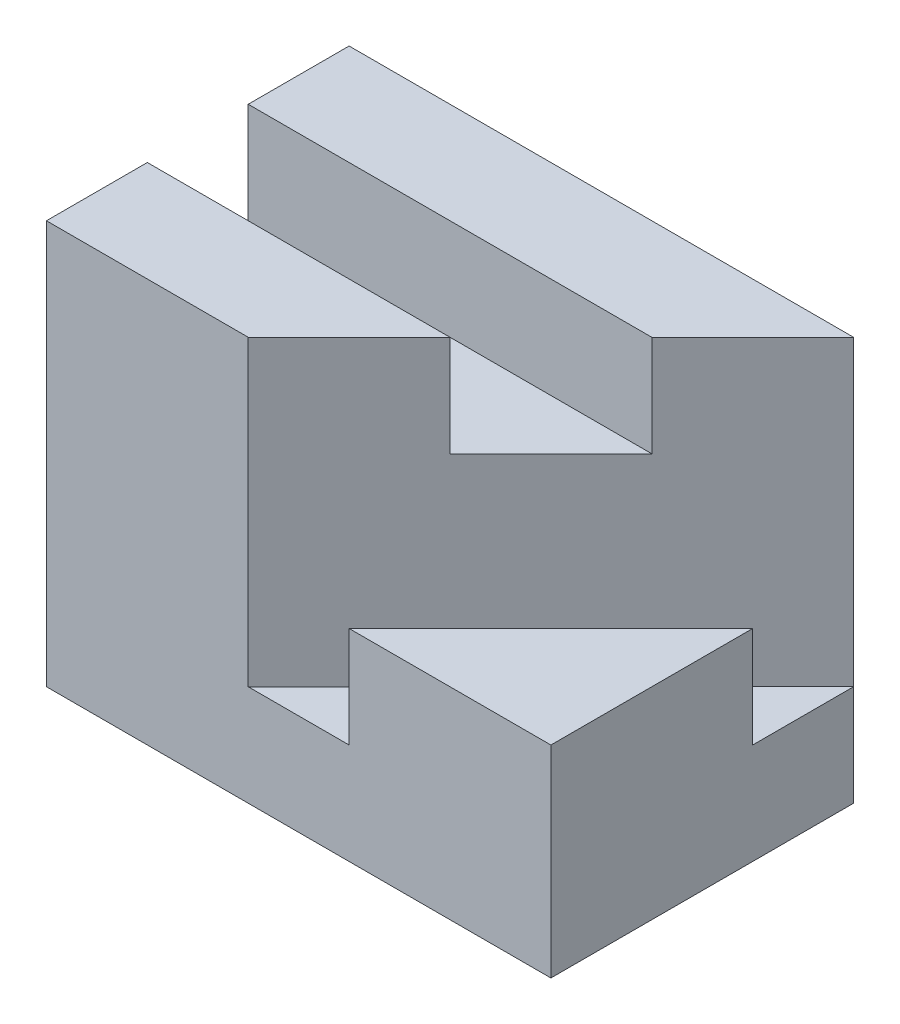
ISO-10303-21;
HEADER;
FILE_DESCRIPTION(('STEP AP214'),'2;1');
FILE_NAME('part.step','',(''),(''),'','','');
FILE_SCHEMA(('AUTOMOTIVE_DESIGN { 1 0 10303 214 1 1 1 1 }'));
ENDSEC;
DATA;
#1=APPLICATION_CONTEXT('core data for automotive mechanical design processes');
#2=APPLICATION_PROTOCOL_DEFINITION('international standard','automotive_design',2000,#1);
#3=PRODUCT_CONTEXT('',#1,'mechanical');
#4=PRODUCT('Part','Part','',(#3));
#5=PRODUCT_RELATED_PRODUCT_CATEGORY('part','',(#4));
#6=PRODUCT_DEFINITION_FORMATION('','',#4);
#7=PRODUCT_DEFINITION_CONTEXT('part definition',#1,'design');
#8=PRODUCT_DEFINITION('design','',#6,#7);
#9=PRODUCT_DEFINITION_SHAPE('','',#8);
#10=(LENGTH_UNIT() NAMED_UNIT(*) SI_UNIT(.MILLI.,.METRE.));
#11=(NAMED_UNIT(*) PLANE_ANGLE_UNIT() SI_UNIT($,.RADIAN.));
#12=(NAMED_UNIT(*) SI_UNIT($,.STERADIAN.) SOLID_ANGLE_UNIT());
#13=UNCERTAINTY_MEASURE_WITH_UNIT(LENGTH_MEASURE(1.E-05),#10,'distance_accuracy_value','');
#14=(GEOMETRIC_REPRESENTATION_CONTEXT(3) GLOBAL_UNCERTAINTY_ASSIGNED_CONTEXT((#13)) GLOBAL_UNIT_ASSIGNED_CONTEXT((#10,
#11,#12)) REPRESENTATION_CONTEXT('',''));
#15=CARTESIAN_POINT('',(0.,0.,0.));
#16=DIRECTION('',(0.,0.,1.));
#17=DIRECTION('',(1.,0.,0.));
#18=AXIS2_PLACEMENT_3D('',#15,#16,#17);
#19=CARTESIAN_POINT('',(-25.,10.,7.50000000000001));
#20=DIRECTION('',(0.,0.,1.));
#21=DIRECTION('',(0.,-1.,0.));
#22=AXIS2_PLACEMENT_3D('',#19,#20,#21);
#23=PLANE('',#22);
#24=DIRECTION('',(0.,-1.,0.));
#25=VECTOR('',#24,1.);
#26=CARTESIAN_POINT('',(0.,10.,7.50000000000001));
#27=LINE('',#26,#25);
#28=CARTESIAN_POINT('',(0.,0.,7.50000000000001));
#29=VERTEX_POINT('',#28);
#30=CARTESIAN_POINT('',(0.,-10.,7.5));
#31=VERTEX_POINT('',#30);
#32=EDGE_CURVE('E129',#29,#31,#27,.T.);
#33=ORIENTED_EDGE('',*,*,#32,.F.);
#34=DIRECTION('',(1.,0.,0.));
#35=VECTOR('',#34,1.);
#36=CARTESIAN_POINT('',(0.,0.,7.50000000000001));
#37=LINE('',#36,#35);
#38=CARTESIAN_POINT('',(-10.,0.,7.50000000000001));
#39=VERTEX_POINT('',#38);
#40=EDGE_CURVE('E120',#39,#29,#37,.T.);
#41=ORIENTED_EDGE('',*,*,#40,.F.);
#42=DIRECTION('',(0.,1.,0.));
#43=VECTOR('',#42,1.);
#44=CARTESIAN_POINT('',(-10.,-5.,7.50000000000001));
#45=LINE('',#44,#43);
#46=CARTESIAN_POINT('',(-10.,-5.,7.50000000000001));
#47=VERTEX_POINT('',#46);
#48=EDGE_CURVE('E127',#47,#39,#45,.T.);
#49=ORIENTED_EDGE('',*,*,#48,.F.);
#50=DIRECTION('',(1.,0.,0.));
#51=VECTOR('',#50,1.);
#52=CARTESIAN_POINT('',(-15.,-5.,7.50000000000001));
#53=LINE('',#52,#51);
#54=CARTESIAN_POINT('',(-15.,-5.,7.50000000000001));
#55=VERTEX_POINT('',#54);
#56=EDGE_CURVE('E233',#55,#47,#53,.T.);
#57=ORIENTED_EDGE('',*,*,#56,.F.);
#58=DIRECTION('',(0.,1.,0.));
#59=VECTOR('',#58,1.);
#60=CARTESIAN_POINT('',(-15.,-5.,7.50000000000001));
#61=LINE('',#60,#59);
#62=CARTESIAN_POINT('',(-15.,10.,7.50000000000001));
#63=VERTEX_POINT('',#62);
#64=EDGE_CURVE('E135',#55,#63,#61,.T.);
#65=ORIENTED_EDGE('',*,*,#64,.T.);
#66=DIRECTION('',(1.,0.,0.));
#67=VECTOR('',#66,1.);
#68=CARTESIAN_POINT('',(-25.,10.,7.50000000000001));
#69=LINE('',#68,#67);
#70=CARTESIAN_POINT('',(-25.,10.,7.50000000000001));
#71=VERTEX_POINT('',#70);
#72=EDGE_CURVE('E184',#71,#63,#69,.T.);
#73=ORIENTED_EDGE('',*,*,#72,.F.);
#74=DIRECTION('',(0.,-1.,0.));
#75=VECTOR('',#74,1.);
#76=CARTESIAN_POINT('',(-25.,10.,7.50000000000001));
#77=LINE('',#76,#75);
#78=CARTESIAN_POINT('',(-25.,-10.,7.5));
#79=VERTEX_POINT('',#78);
#80=EDGE_CURVE('E172',#71,#79,#77,.T.);
#81=ORIENTED_EDGE('',*,*,#80,.T.);
#82=DIRECTION('',(1.,0.,0.));
#83=VECTOR('',#82,1.);
#84=CARTESIAN_POINT('',(-25.,-10.,7.5));
#85=LINE('',#84,#83);
#86=EDGE_CURVE('E42',#79,#31,#85,.T.);
#87=ORIENTED_EDGE('',*,*,#86,.T.);
#88=EDGE_LOOP('',(#33,#41,#49,#57,#65,#73,#81,#87));
#89=FACE_BOUND('',#88,.T.);
#90=ADVANCED_FACE('F33',(#89),#23,.T.);
#91=CARTESIAN_POINT('',(0.,0.,0.));
#92=DIRECTION('',(1.,0.,0.));
#93=DIRECTION('',(0.,0.,-1.));
#94=AXIS2_PLACEMENT_3D('',#91,#92,#93);
#95=PLANE('',#94);
#96=DIRECTION('',(0.,1.,0.));
#97=VECTOR('',#96,1.);
#98=CARTESIAN_POINT('',(0.,-5.,-2.5));
#99=LINE('',#98,#97);
#100=CARTESIAN_POINT('',(0.,-5.,-2.5));
#101=VERTEX_POINT('',#100);
#102=CARTESIAN_POINT('',(0.,0.,-2.5));
#103=VERTEX_POINT('',#102);
#104=EDGE_CURVE('E57',#101,#103,#99,.T.);
#105=ORIENTED_EDGE('',*,*,#104,.T.);
#106=DIRECTION('',(0.,0.,-1.));
#107=VECTOR('',#106,1.);
#108=CARTESIAN_POINT('',(0.,0.,0.));
#109=LINE('',#108,#107);
#110=EDGE_CURVE('E50',#29,#103,#109,.T.);
#111=ORIENTED_EDGE('',*,*,#110,.F.);
#112=ORIENTED_EDGE('',*,*,#32,.T.);
#113=DIRECTION('',(0.,0.,-1.));
#114=VECTOR('',#113,1.);
#115=CARTESIAN_POINT('',(0.,-10.,7.5));
#116=LINE('',#115,#114);
#117=CARTESIAN_POINT('',(0.,-10.,-7.5));
#118=VERTEX_POINT('',#117);
#119=EDGE_CURVE('E157',#31,#118,#116,.T.);
#120=ORIENTED_EDGE('',*,*,#119,.T.);
#121=DIRECTION('',(0.,1.,0.));
#122=VECTOR('',#121,1.);
#123=CARTESIAN_POINT('',(0.,10.,-7.5));
#124=LINE('',#123,#122);
#125=CARTESIAN_POINT('',(0.,-5.,-7.5));
#126=VERTEX_POINT('',#125);
#127=EDGE_CURVE('E152',#118,#126,#124,.T.);
#128=ORIENTED_EDGE('',*,*,#127,.T.);
#129=DIRECTION('',(0.,0.,1.));
#130=VECTOR('',#129,1.);
#131=CARTESIAN_POINT('',(0.,-5.,-7.5));
#132=LINE('',#131,#130);
#133=EDGE_CURVE('E226',#126,#101,#132,.T.);
#134=ORIENTED_EDGE('',*,*,#133,.T.);
#135=EDGE_LOOP('',(#105,#111,#112,#120,#128,#134));
#136=FACE_BOUND('',#135,.T.);
#137=ADVANCED_FACE('F244',(#136),#95,.T.);
#138=CARTESIAN_POINT('',(0.,-5.,-2.5));
#139=DIRECTION('',(-0.707106781186548,0.,-0.707106781186547));
#140=DIRECTION('',(-0.707106781186547,0.,0.707106781186548));
#141=AXIS2_PLACEMENT_3D('',#138,#139,#140);
#142=PLANE('',#141);
#143=ORIENTED_EDGE('',*,*,#48,.T.);
#144=DIRECTION('',(-0.707106781186548,0.,0.707106781186548));
#145=VECTOR('',#144,1.);
#146=CARTESIAN_POINT('',(-1.25,0.,-1.25));
#147=LINE('',#146,#145);
#148=EDGE_CURVE('E117',#103,#39,#147,.T.);
#149=ORIENTED_EDGE('',*,*,#148,.F.);
#150=ORIENTED_EDGE('',*,*,#104,.F.);
#151=DIRECTION('',(-0.707106781186547,0.,0.707106781186548));
#152=VECTOR('',#151,1.);
#153=CARTESIAN_POINT('',(0.,-5.,-2.5));
#154=LINE('',#153,#152);
#155=EDGE_CURVE('E133',#101,#47,#154,.T.);
#156=ORIENTED_EDGE('',*,*,#155,.T.);
#157=EDGE_LOOP('',(#143,#149,#150,#156));
#158=FACE_BOUND('',#157,.T.);
#159=ADVANCED_FACE('F132',(#158),#142,.T.);
#160=CARTESIAN_POINT('',(-25.,10.,7.50000000000001));
#161=DIRECTION('',(0.,1.,0.));
#162=DIRECTION('',(0.,0.,1.));
#163=AXIS2_PLACEMENT_3D('',#160,#161,#162);
#164=PLANE('',#163);
#165=ORIENTED_EDGE('',*,*,#72,.T.);
#166=DIRECTION('',(0.707106781186547,0.,-0.707106781186548));
#167=VECTOR('',#166,1.);
#168=CARTESIAN_POINT('',(-15.,10.,7.50000000000001));
#169=LINE('',#168,#167);
#170=CARTESIAN_POINT('',(-9.99999999999999,10.,2.5));
#171=VERTEX_POINT('',#170);
#172=EDGE_CURVE('E225',#63,#171,#169,.T.);
#173=ORIENTED_EDGE('',*,*,#172,.T.);
#174=DIRECTION('',(1.,0.,0.));
#175=VECTOR('',#174,1.);
#176=CARTESIAN_POINT('',(-25.,10.,2.5));
#177=LINE('',#176,#175);
#178=CARTESIAN_POINT('',(-25.,10.,2.5));
#179=VERTEX_POINT('',#178);
#180=EDGE_CURVE('E187',#179,#171,#177,.T.);
#181=ORIENTED_EDGE('',*,*,#180,.F.);
#182=DIRECTION('',(0.,0.,1.));
#183=VECTOR('',#182,1.);
#184=CARTESIAN_POINT('',(-25.,10.,7.50000000000001));
#185=LINE('',#184,#183);
#186=EDGE_CURVE('E169',#179,#71,#185,.T.);
#187=ORIENTED_EDGE('',*,*,#186,.T.);
#188=EDGE_LOOP('',(#165,#173,#181,#187));
#189=FACE_BOUND('',#188,.T.);
#190=ADVANCED_FACE('F223',(#189),#164,.T.);
#191=CARTESIAN_POINT('',(-25.,10.,2.5));
#192=DIRECTION('',(0.,0.,-1.));
#193=DIRECTION('',(-1.,0.,0.));
#194=AXIS2_PLACEMENT_3D('',#191,#192,#193);
#195=PLANE('',#194);
#196=ORIENTED_EDGE('',*,*,#180,.T.);
#197=DIRECTION('',(0.,-1.,0.));
#198=VECTOR('',#197,1.);
#199=CARTESIAN_POINT('',(-9.99999999999999,10.,2.5));
#200=LINE('',#199,#198);
#201=CARTESIAN_POINT('',(-9.99999999999999,5.,2.5));
#202=VERTEX_POINT('',#201);
#203=EDGE_CURVE('E149',#171,#202,#200,.T.);
#204=ORIENTED_EDGE('',*,*,#203,.T.);
#205=DIRECTION('',(1.,0.,0.));
#206=VECTOR('',#205,1.);
#207=CARTESIAN_POINT('',(-25.,5.,2.5));
#208=LINE('',#207,#206);
#209=CARTESIAN_POINT('',(-25.,5.,2.5));
#210=VERTEX_POINT('',#209);
#211=EDGE_CURVE('E190',#210,#202,#208,.T.);
#212=ORIENTED_EDGE('',*,*,#211,.F.);
#213=DIRECTION('',(0.,1.,0.));
#214=VECTOR('',#213,1.);
#215=CARTESIAN_POINT('',(-25.,10.,2.5));
#216=LINE('',#215,#214);
#217=EDGE_CURVE('E166',#210,#179,#216,.T.);
#218=ORIENTED_EDGE('',*,*,#217,.T.);
#219=EDGE_LOOP('',(#196,#204,#212,#218));
#220=FACE_BOUND('',#219,.T.);
#221=ADVANCED_FACE('F219',(#220),#195,.T.);
#222=CARTESIAN_POINT('',(-25.,5.,2.5));
#223=DIRECTION('',(0.,1.,0.));
#224=DIRECTION('',(0.,0.,1.));
#225=AXIS2_PLACEMENT_3D('',#222,#223,#224);
#226=PLANE('',#225);
#227=ORIENTED_EDGE('',*,*,#211,.T.);
#228=DIRECTION('',(0.707106781186547,0.,-0.707106781186548));
#229=VECTOR('',#228,1.);
#230=CARTESIAN_POINT('',(-17.5,5.,10.));
#231=LINE('',#230,#229);
#232=CARTESIAN_POINT('',(-4.99999999999999,5.,-2.5));
#233=VERTEX_POINT('',#232);
#234=EDGE_CURVE('E146',#202,#233,#231,.T.);
#235=ORIENTED_EDGE('',*,*,#234,.T.);
#236=DIRECTION('',(1.,0.,0.));
#237=VECTOR('',#236,1.);
#238=CARTESIAN_POINT('',(-25.,5.,-2.5));
#239=LINE('',#238,#237);
#240=CARTESIAN_POINT('',(-25.,5.,-2.5));
#241=VERTEX_POINT('',#240);
#242=EDGE_CURVE('E193',#241,#233,#239,.T.);
#243=ORIENTED_EDGE('',*,*,#242,.F.);
#244=DIRECTION('',(0.,0.,1.));
#245=VECTOR('',#244,1.);
#246=CARTESIAN_POINT('',(-25.,5.,2.5));
#247=LINE('',#246,#245);
#248=EDGE_CURVE('E163',#241,#210,#247,.T.);
#249=ORIENTED_EDGE('',*,*,#248,.T.);
#250=EDGE_LOOP('',(#227,#235,#243,#249));
#251=FACE_BOUND('',#250,.T.);
#252=ADVANCED_FACE('F217',(#251),#226,.T.);
#253=CARTESIAN_POINT('',(-25.,10.,-2.5));
#254=DIRECTION('',(0.,0.,1.));
#255=DIRECTION('',(0.,-1.,0.));
#256=AXIS2_PLACEMENT_3D('',#253,#254,#255);
#257=PLANE('',#256);
#258=ORIENTED_EDGE('',*,*,#242,.T.);
#259=DIRECTION('',(0.,1.,0.));
#260=VECTOR('',#259,1.);
#261=CARTESIAN_POINT('',(-4.99999999999999,10.,-2.5));
#262=LINE('',#261,#260);
#263=CARTESIAN_POINT('',(-4.99999999999999,10.,-2.5));
#264=VERTEX_POINT('',#263);
#265=EDGE_CURVE('E137',#233,#264,#262,.T.);
#266=ORIENTED_EDGE('',*,*,#265,.T.);
#267=DIRECTION('',(1.,0.,0.));
#268=VECTOR('',#267,1.);
#269=CARTESIAN_POINT('',(-25.,10.,-2.5));
#270=LINE('',#269,#268);
#271=CARTESIAN_POINT('',(-25.,10.,-2.5));
#272=VERTEX_POINT('',#271);
#273=EDGE_CURVE('E195',#272,#264,#270,.T.);
#274=ORIENTED_EDGE('',*,*,#273,.F.);
#275=DIRECTION('',(0.,-1.,0.));
#276=VECTOR('',#275,1.);
#277=CARTESIAN_POINT('',(-25.,10.,-2.5));
#278=LINE('',#277,#276);
#279=EDGE_CURVE('E160',#272,#241,#278,.T.);
#280=ORIENTED_EDGE('',*,*,#279,.T.);
#281=EDGE_LOOP('',(#258,#266,#274,#280));
#282=FACE_BOUND('',#281,.T.);
#283=ADVANCED_FACE('F213',(#282),#257,.T.);
#284=CARTESIAN_POINT('',(-25.,10.,-2.5));
#285=DIRECTION('',(0.,1.,0.));
#286=DIRECTION('',(0.,0.,1.));
#287=AXIS2_PLACEMENT_3D('',#284,#285,#286);
#288=PLANE('',#287);
#289=ORIENTED_EDGE('',*,*,#273,.T.);
#290=CARTESIAN_POINT('',(0.,10.,-7.5));
#291=VERTEX_POINT('',#290);
#292=EDGE_CURVE('E130',#264,#291,#169,.T.);
#293=ORIENTED_EDGE('',*,*,#292,.T.);
#294=DIRECTION('',(1.,0.,0.));
#295=VECTOR('',#294,1.);
#296=CARTESIAN_POINT('',(-25.,10.,-7.5));
#297=LINE('',#296,#295);
#298=CARTESIAN_POINT('',(-25.,10.,-7.5));
#299=VERTEX_POINT('',#298);
#300=EDGE_CURVE('E37',#299,#291,#297,.T.);
#301=ORIENTED_EDGE('',*,*,#300,.F.);
#302=DIRECTION('',(0.,0.,1.));
#303=VECTOR('',#302,1.);
#304=CARTESIAN_POINT('',(-25.,10.,-2.5));
#305=LINE('',#304,#303);
#306=EDGE_CURVE('E156',#299,#272,#305,.T.);
#307=ORIENTED_EDGE('',*,*,#306,.T.);
#308=EDGE_LOOP('',(#289,#293,#301,#307));
#309=FACE_BOUND('',#308,.T.);
#310=ADVANCED_FACE('F205',(#309),#288,.T.);
#311=CARTESIAN_POINT('',(-25.,10.,-7.5));
#312=DIRECTION('',(0.,0.,-1.));
#313=DIRECTION('',(0.,1.,0.));
#314=AXIS2_PLACEMENT_3D('',#311,#312,#313);
#315=PLANE('',#314);
#316=ORIENTED_EDGE('',*,*,#127,.F.);
#317=DIRECTION('',(1.,0.,0.));
#318=VECTOR('',#317,1.);
#319=CARTESIAN_POINT('',(-25.,-10.,-7.5));
#320=LINE('',#319,#318);
#321=CARTESIAN_POINT('',(-25.,-10.,-7.5));
#322=VERTEX_POINT('',#321);
#323=EDGE_CURVE('E11',#322,#118,#320,.T.);
#324=ORIENTED_EDGE('',*,*,#323,.F.);
#325=DIRECTION('',(0.,1.,0.));
#326=VECTOR('',#325,1.);
#327=CARTESIAN_POINT('',(-25.,10.,-7.5));
#328=LINE('',#327,#326);
#329=EDGE_CURVE('E153',#322,#299,#328,.T.);
#330=ORIENTED_EDGE('',*,*,#329,.T.);
#331=ORIENTED_EDGE('',*,*,#300,.T.);
#332=DIRECTION('',(0.,1.,0.));
#333=VECTOR('',#332,1.);
#334=CARTESIAN_POINT('',(0.,-5.,-7.5));
#335=LINE('',#334,#333);
#336=EDGE_CURVE('E140',#126,#291,#335,.T.);
#337=ORIENTED_EDGE('',*,*,#336,.F.);
#338=EDGE_LOOP('',(#316,#324,#330,#331,#337));
#339=FACE_BOUND('',#338,.T.);
#340=ADVANCED_FACE('F35',(#339),#315,.T.);
#341=CARTESIAN_POINT('',(-25.,-10.,7.5));
#342=DIRECTION('',(0.,-1.,0.));
#343=DIRECTION('',(0.,0.,-1.));
#344=AXIS2_PLACEMENT_3D('',#341,#342,#343);
#345=PLANE('',#344);
#346=ORIENTED_EDGE('',*,*,#119,.F.);
#347=ORIENTED_EDGE('',*,*,#86,.F.);
#348=DIRECTION('',(0.,0.,-1.));
#349=VECTOR('',#348,1.);
#350=CARTESIAN_POINT('',(-25.,-10.,7.5));
#351=LINE('',#350,#349);
#352=EDGE_CURVE('E175',#79,#322,#351,.T.);
#353=ORIENTED_EDGE('',*,*,#352,.T.);
#354=ORIENTED_EDGE('',*,*,#323,.T.);
#355=EDGE_LOOP('',(#346,#347,#353,#354));
#356=FACE_BOUND('',#355,.T.);
#357=ADVANCED_FACE('F242',(#356),#345,.T.);
#358=CARTESIAN_POINT('',(-25.,0.,0.));
#359=DIRECTION('',(1.,0.,0.));
#360=DIRECTION('',(0.,0.,-1.));
#361=AXIS2_PLACEMENT_3D('',#358,#359,#360);
#362=PLANE('',#361);
#363=ORIENTED_EDGE('',*,*,#329,.F.);
#364=ORIENTED_EDGE('',*,*,#352,.F.);
#365=ORIENTED_EDGE('',*,*,#80,.F.);
#366=ORIENTED_EDGE('',*,*,#186,.F.);
#367=ORIENTED_EDGE('',*,*,#217,.F.);
#368=ORIENTED_EDGE('',*,*,#248,.F.);
#369=ORIENTED_EDGE('',*,*,#279,.F.);
#370=ORIENTED_EDGE('',*,*,#306,.F.);
#371=EDGE_LOOP('',(#363,#364,#365,#366,#367,#368,#369,#370));
#372=FACE_BOUND('',#371,.T.);
#373=ADVANCED_FACE('F208',(#372),#362,.F.);
#374=CARTESIAN_POINT('',(-15.,-5.,7.50000000000001));
#375=DIRECTION('',(0.707106781186548,0.,0.707106781186547));
#376=DIRECTION('',(0.707106781186547,0.,-0.707106781186548));
#377=AXIS2_PLACEMENT_3D('',#374,#375,#376);
#378=PLANE('',#377);
#379=ORIENTED_EDGE('',*,*,#172,.F.);
#380=ORIENTED_EDGE('',*,*,#64,.F.);
#381=DIRECTION('',(0.707106781186547,0.,-0.707106781186548));
#382=VECTOR('',#381,1.);
#383=CARTESIAN_POINT('',(-15.,-5.,7.50000000000001));
#384=LINE('',#383,#382);
#385=EDGE_CURVE('E231',#55,#126,#384,.T.);
#386=ORIENTED_EDGE('',*,*,#385,.T.);
#387=ORIENTED_EDGE('',*,*,#336,.T.);
#388=ORIENTED_EDGE('',*,*,#292,.F.);
#389=ORIENTED_EDGE('',*,*,#265,.F.);
#390=ORIENTED_EDGE('',*,*,#234,.F.);
#391=ORIENTED_EDGE('',*,*,#203,.F.);
#392=EDGE_LOOP('',(#379,#380,#386,#387,#388,#389,#390,#391));
#393=FACE_BOUND('',#392,.T.);
#394=ADVANCED_FACE('F215',(#393),#378,.T.);
#395=CARTESIAN_POINT('',(0.,-5.,0.));
#396=DIRECTION('',(0.,1.,0.));
#397=DIRECTION('',(0.,0.,1.));
#398=AXIS2_PLACEMENT_3D('',#395,#396,#397);
#399=PLANE('',#398);
#400=ORIENTED_EDGE('',*,*,#133,.F.);
#401=ORIENTED_EDGE('',*,*,#385,.F.);
#402=ORIENTED_EDGE('',*,*,#56,.T.);
#403=ORIENTED_EDGE('',*,*,#155,.F.);
#404=EDGE_LOOP('',(#400,#401,#402,#403));
#405=FACE_BOUND('',#404,.T.);
#406=ADVANCED_FACE('F239',(#405),#399,.T.);
#407=CARTESIAN_POINT('',(0.,0.,0.));
#408=DIRECTION('',(0.,1.,0.));
#409=DIRECTION('',(0.,0.,1.));
#410=AXIS2_PLACEMENT_3D('',#407,#408,#409);
#411=PLANE('',#410);
#412=ORIENTED_EDGE('',*,*,#110,.T.);
#413=ORIENTED_EDGE('',*,*,#148,.T.);
#414=ORIENTED_EDGE('',*,*,#40,.T.);
#415=EDGE_LOOP('',(#412,#413,#414));
#416=FACE_BOUND('',#415,.T.);
#417=ADVANCED_FACE('F119',(#416),#411,.T.);
#418=CLOSED_SHELL('',(#90,#137,#159,#190,#221,#252,#283,#310,#340,#357,#373,#394,#406,#417));
#419=MANIFOLD_SOLID_BREP('B2',#418);
#420=ADVANCED_BREP_SHAPE_REPRESENTATION('',(#18,#419),#14);
#421=SHAPE_DEFINITION_REPRESENTATION(#9,#420);
ENDSEC;
END-ISO-10303-21;
